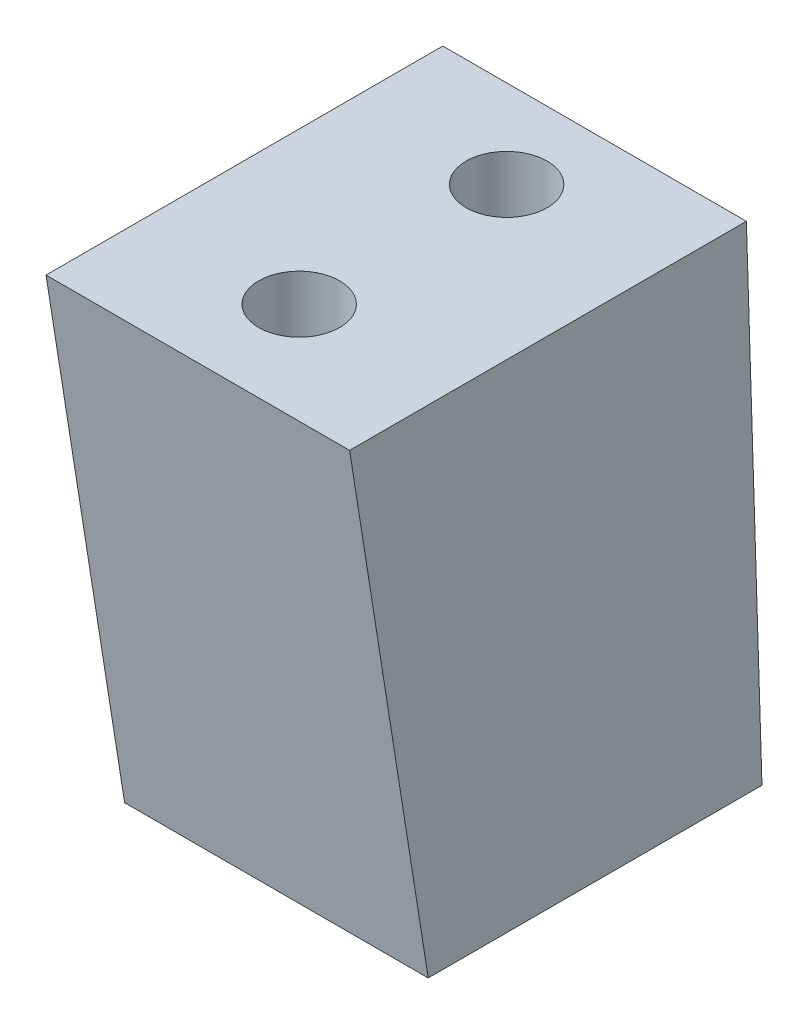
ISO-10303-21;
HEADER;
FILE_DESCRIPTION(('STEP AP214'),'2;1');
FILE_NAME('part.step','',(''),(''),'','','');
FILE_SCHEMA(('AUTOMOTIVE_DESIGN { 1 0 10303 214 1 1 1 1 }'));
ENDSEC;
DATA;
#1=APPLICATION_CONTEXT('core data for automotive mechanical design processes');
#2=APPLICATION_PROTOCOL_DEFINITION('international standard','automotive_design',2000,#1);
#3=PRODUCT_CONTEXT('',#1,'mechanical');
#4=PRODUCT('Part','Part','',(#3));
#5=PRODUCT_RELATED_PRODUCT_CATEGORY('part','',(#4));
#6=PRODUCT_DEFINITION_FORMATION('','',#4);
#7=PRODUCT_DEFINITION_CONTEXT('part definition',#1,'design');
#8=PRODUCT_DEFINITION('design','',#6,#7);
#9=PRODUCT_DEFINITION_SHAPE('','',#8);
#10=(LENGTH_UNIT() NAMED_UNIT(*) SI_UNIT(.MILLI.,.METRE.));
#11=(NAMED_UNIT(*) PLANE_ANGLE_UNIT() SI_UNIT($,.RADIAN.));
#12=(NAMED_UNIT(*) SI_UNIT($,.STERADIAN.) SOLID_ANGLE_UNIT());
#13=UNCERTAINTY_MEASURE_WITH_UNIT(LENGTH_MEASURE(1.E-05),#10,'distance_accuracy_value','');
#14=(GEOMETRIC_REPRESENTATION_CONTEXT(3) GLOBAL_UNCERTAINTY_ASSIGNED_CONTEXT((#13)) GLOBAL_UNIT_ASSIGNED_CONTEXT((#10,
#11,#12)) REPRESENTATION_CONTEXT('',''));
#15=CARTESIAN_POINT('',(0.,0.,0.));
#16=DIRECTION('',(0.,0.,1.));
#17=DIRECTION('',(1.,0.,0.));
#18=AXIS2_PLACEMENT_3D('',#15,#16,#17);
#19=CARTESIAN_POINT('',(0.,0.,-20.5));
#20=DIRECTION('',(1.,0.,0.));
#21=DIRECTION('',(0.,0.,-1.));
#22=AXIS2_PLACEMENT_3D('',#19,#20,#21);
#23=PLANE('',#22);
#24=DIRECTION('',(0.,0.,1.));
#25=VECTOR('',#24,1.);
#26=CARTESIAN_POINT('',(0.,0.,-20.5));
#27=LINE('',#26,#25);
#28=CARTESIAN_POINT('',(0.,0.,-20.4905720433827));
#29=VERTEX_POINT('',#28);
#30=CARTESIAN_POINT('',(0.,0.,-4.00000000000018));
#31=VERTEX_POINT('',#30);
#32=EDGE_CURVE('E93',#29,#31,#27,.T.);
#33=ORIENTED_EDGE('',*,*,#32,.F.);
#34=DIRECTION('',(0.,0.999506560365732,0.0314107590781247));
#35=VECTOR('',#34,1.);
#36=CARTESIAN_POINT('',(0.,-0.00029599314704986,-20.4905813453421));
#37=LINE('',#36,#35);
#38=CARTESIAN_POINT('',(0.,24.52,-19.7199999999998));
#39=VERTEX_POINT('',#38);
#40=EDGE_CURVE('E11',#29,#39,#37,.T.);
#41=ORIENTED_EDGE('',*,*,#40,.T.);
#42=DIRECTION('',(0.,0.,1.));
#43=VECTOR('',#42,1.);
#44=CARTESIAN_POINT('',(0.,24.52,-20.5));
#45=LINE('',#44,#43);
#46=CARTESIAN_POINT('',(0.,24.52,-0.116413523242619));
#47=VERTEX_POINT('',#46);
#48=EDGE_CURVE('E75',#39,#47,#45,.T.);
#49=ORIENTED_EDGE('',*,*,#48,.T.);
#50=DIRECTION('',(0.,0.987688340595138,0.156434465040228));
#51=VECTOR('',#50,1.);
#52=CARTESIAN_POINT('',(0.,-2.54939020359325,-4.40378374056514));
#53=LINE('',#52,#51);
#54=EDGE_CURVE('E78',#47,#31,#53,.F.);
#55=ORIENTED_EDGE('',*,*,#54,.T.);
#56=EDGE_LOOP('',(#33,#41,#49,#55));
#57=FACE_BOUND('',#56,.T.);
#58=ADVANCED_FACE('F35',(#57),#23,.T.);
#59=CARTESIAN_POINT('',(0.,0.,-20.5));
#60=DIRECTION('',(0.,-1.,0.));
#61=DIRECTION('',(0.,0.,-1.));
#62=AXIS2_PLACEMENT_3D('',#59,#60,#61);
#63=PLANE('',#62);
#64=CARTESIAN_POINT('',(-7.5,0.,-15.375));
#65=DIRECTION('',(0.,-1.,0.));
#66=DIRECTION('',(0.,0.,-1.));
#67=AXIS2_PLACEMENT_3D('',#64,#65,#66);
#68=CIRCLE('',#67,2.);
#69=CARTESIAN_POINT('',(-7.5,0.,-17.375));
#70=VERTEX_POINT('',#69);
#71=EDGE_CURVE('E119',#70,#70,#68,.T.);
#72=ORIENTED_EDGE('',*,*,#71,.F.);
#73=EDGE_LOOP('',(#72));
#74=FACE_BOUND('',#73,.T.);
#75=CARTESIAN_POINT('',(-7.5,0.,-7.6875));
#76=DIRECTION('',(0.,-1.,0.));
#77=DIRECTION('',(0.,0.,-1.));
#78=AXIS2_PLACEMENT_3D('',#75,#76,#77);
#79=CIRCLE('',#78,2.);
#80=CARTESIAN_POINT('',(-7.5,0.,-9.6875));
#81=VERTEX_POINT('',#80);
#82=EDGE_CURVE('E112',#81,#81,#79,.T.);
#83=ORIENTED_EDGE('',*,*,#82,.F.);
#84=EDGE_LOOP('',(#83));
#85=FACE_BOUND('',#84,.T.);
#86=DIRECTION('',(0.,0.,1.));
#87=VECTOR('',#86,1.);
#88=CARTESIAN_POINT('',(-15.,0.,-20.5));
#89=LINE('',#88,#87);
#90=CARTESIAN_POINT('',(-15.,0.,-20.4905720433827));
#91=VERTEX_POINT('',#90);
#92=CARTESIAN_POINT('',(-15.,0.,-4.00000000000018));
#93=VERTEX_POINT('',#92);
#94=EDGE_CURVE('E107',#91,#93,#89,.T.);
#95=ORIENTED_EDGE('',*,*,#94,.F.);
#96=DIRECTION('',(1.,0.,0.));
#97=VECTOR('',#96,1.);
#98=CARTESIAN_POINT('',(0.,0.,-20.4905720433827));
#99=LINE('',#98,#97);
#100=EDGE_CURVE('E44',#91,#29,#99,.T.);
#101=ORIENTED_EDGE('',*,*,#100,.T.);
#102=ORIENTED_EDGE('',*,*,#32,.T.);
#103=DIRECTION('',(-1.,0.,0.));
#104=VECTOR('',#103,1.);
#105=CARTESIAN_POINT('',(0.,0.,-4.00000000000018));
#106=LINE('',#105,#104);
#107=EDGE_CURVE('E97',#31,#93,#106,.T.);
#108=ORIENTED_EDGE('',*,*,#107,.T.);
#109=EDGE_LOOP('',(#95,#101,#102,#108));
#110=FACE_BOUND('',#109,.T.);
#111=ADVANCED_FACE('F167',(#74,#85,#110),#63,.T.);
#112=CARTESIAN_POINT('',(-15.,0.,-20.5));
#113=DIRECTION('',(-1.,0.,0.));
#114=DIRECTION('',(0.,0.,1.));
#115=AXIS2_PLACEMENT_3D('',#112,#113,#114);
#116=PLANE('',#115);
#117=DIRECTION('',(0.,0.,1.));
#118=VECTOR('',#117,1.);
#119=CARTESIAN_POINT('',(-15.,24.52,-20.5));
#120=LINE('',#119,#118);
#121=CARTESIAN_POINT('',(-15.,24.52,-19.7199999999998));
#122=VERTEX_POINT('',#121);
#123=CARTESIAN_POINT('',(-15.,24.52,-0.116413523242619));
#124=VERTEX_POINT('',#123);
#125=EDGE_CURVE('E84',#122,#124,#120,.T.);
#126=ORIENTED_EDGE('',*,*,#125,.F.);
#127=DIRECTION('',(0.,-0.999506560365732,-0.0314107590781247));
#128=VECTOR('',#127,1.);
#129=CARTESIAN_POINT('',(-15.,-0.000295993147049864,-20.4905813453421));
#130=LINE('',#129,#128);
#131=EDGE_CURVE('E58',#122,#91,#130,.T.);
#132=ORIENTED_EDGE('',*,*,#131,.T.);
#133=ORIENTED_EDGE('',*,*,#94,.T.);
#134=DIRECTION('',(0.,-0.987688340595138,-0.156434465040228));
#135=VECTOR('',#134,1.);
#136=CARTESIAN_POINT('',(-15.,-2.54939020359325,-4.40378374056514));
#137=LINE('',#136,#135);
#138=EDGE_CURVE('E99',#93,#124,#137,.F.);
#139=ORIENTED_EDGE('',*,*,#138,.T.);
#140=EDGE_LOOP('',(#126,#132,#133,#139));
#141=FACE_BOUND('',#140,.T.);
#142=ADVANCED_FACE('F106',(#141),#116,.T.);
#143=CARTESIAN_POINT('',(0.,24.52,-20.5));
#144=DIRECTION('',(0.,1.,0.));
#145=DIRECTION('',(-1.,0.,0.));
#146=AXIS2_PLACEMENT_3D('',#143,#144,#145);
#147=PLANE('',#146);
#148=CARTESIAN_POINT('',(-7.5,24.52,-15.375));
#149=DIRECTION('',(0.,1.,0.));
#150=DIRECTION('',(-1.,0.,0.));
#151=AXIS2_PLACEMENT_3D('',#148,#149,#150);
#152=CIRCLE('',#151,2.);
#153=CARTESIAN_POINT('',(-9.5,24.52,-15.375));
#154=VERTEX_POINT('',#153);
#155=EDGE_CURVE('E130',#154,#154,#152,.T.);
#156=ORIENTED_EDGE('',*,*,#155,.F.);
#157=EDGE_LOOP('',(#156));
#158=FACE_BOUND('',#157,.T.);
#159=CARTESIAN_POINT('',(-7.5,24.52,-5.125));
#160=DIRECTION('',(0.,1.,0.));
#161=DIRECTION('',(-1.,0.,0.));
#162=AXIS2_PLACEMENT_3D('',#159,#160,#161);
#163=CIRCLE('',#162,2.);
#164=CARTESIAN_POINT('',(-9.5,24.52,-5.125));
#165=VERTEX_POINT('',#164);
#166=EDGE_CURVE('E124',#165,#165,#163,.T.);
#167=ORIENTED_EDGE('',*,*,#166,.F.);
#168=EDGE_LOOP('',(#167));
#169=FACE_BOUND('',#168,.T.);
#170=ORIENTED_EDGE('',*,*,#48,.F.);
#171=DIRECTION('',(-1.,0.,0.));
#172=VECTOR('',#171,1.);
#173=CARTESIAN_POINT('',(-15.,24.52,-19.7199999999998));
#174=LINE('',#173,#172);
#175=EDGE_CURVE('E103',#39,#122,#174,.T.);
#176=ORIENTED_EDGE('',*,*,#175,.T.);
#177=ORIENTED_EDGE('',*,*,#125,.T.);
#178=DIRECTION('',(-1.,0.,0.));
#179=VECTOR('',#178,1.);
#180=CARTESIAN_POINT('',(0.,24.52,-0.116413523242619));
#181=LINE('',#180,#179);
#182=EDGE_CURVE('E88',#124,#47,#181,.F.);
#183=ORIENTED_EDGE('',*,*,#182,.T.);
#184=EDGE_LOOP('',(#170,#176,#177,#183));
#185=FACE_BOUND('',#184,.T.);
#186=ADVANCED_FACE('F89',(#158,#169,#185),#147,.T.);
#187=CARTESIAN_POINT('',(-7.5,3.,-7.6875));
#188=DIRECTION('',(0.,-1.,0.));
#189=DIRECTION('',(0.,0.,-1.));
#190=AXIS2_PLACEMENT_3D('',#187,#188,#189);
#191=CYLINDRICAL_SURFACE('',#190,2.);
#192=CARTESIAN_POINT('',(-7.5,3.,-7.6875));
#193=DIRECTION('',(0.,-1.,0.));
#194=DIRECTION('',(0.,0.,-1.));
#195=AXIS2_PLACEMENT_3D('',#192,#193,#194);
#196=CIRCLE('',#195,2.);
#197=CARTESIAN_POINT('',(-7.5,3.,-9.6875));
#198=VERTEX_POINT('',#197);
#199=EDGE_CURVE('E115',#198,#198,#196,.T.);
#200=ORIENTED_EDGE('',*,*,#199,.F.);
#201=EDGE_LOOP('',(#200));
#202=FACE_BOUND('',#201,.T.);
#203=ORIENTED_EDGE('',*,*,#82,.T.);
#204=EDGE_LOOP('',(#203));
#205=FACE_BOUND('',#204,.T.);
#206=ADVANCED_FACE('F147',(#202,#205),#191,.F.);
#207=CARTESIAN_POINT('',(0.,3.,0.));
#208=DIRECTION('',(0.,-1.,0.));
#209=DIRECTION('',(0.,0.,-1.));
#210=AXIS2_PLACEMENT_3D('',#207,#208,#209);
#211=PLANE('',#210);
#212=ORIENTED_EDGE('',*,*,#199,.T.);
#213=EDGE_LOOP('',(#212));
#214=FACE_BOUND('',#213,.T.);
#215=ADVANCED_FACE('F215',(#214),#211,.T.);
#216=CARTESIAN_POINT('',(-7.5,3.,-15.375));
#217=DIRECTION('',(0.,-1.,0.));
#218=DIRECTION('',(0.,0.,-1.));
#219=AXIS2_PLACEMENT_3D('',#216,#217,#218);
#220=CYLINDRICAL_SURFACE('',#219,2.);
#221=CARTESIAN_POINT('',(-7.5,3.,-15.375));
#222=DIRECTION('',(0.,-1.,0.));
#223=DIRECTION('',(0.,0.,-1.));
#224=AXIS2_PLACEMENT_3D('',#221,#222,#223);
#225=CIRCLE('',#224,2.);
#226=CARTESIAN_POINT('',(-7.5,3.,-17.375));
#227=VERTEX_POINT('',#226);
#228=EDGE_CURVE('E85',#227,#227,#225,.T.);
#229=ORIENTED_EDGE('',*,*,#228,.F.);
#230=EDGE_LOOP('',(#229));
#231=FACE_BOUND('',#230,.T.);
#232=ORIENTED_EDGE('',*,*,#71,.T.);
#233=EDGE_LOOP('',(#232));
#234=FACE_BOUND('',#233,.T.);
#235=ADVANCED_FACE('F162',(#231,#234),#220,.F.);
#236=CARTESIAN_POINT('',(0.,3.,0.));
#237=DIRECTION('',(0.,-1.,0.));
#238=DIRECTION('',(0.,0.,-1.));
#239=AXIS2_PLACEMENT_3D('',#236,#237,#238);
#240=PLANE('',#239);
#241=ORIENTED_EDGE('',*,*,#228,.T.);
#242=EDGE_LOOP('',(#241));
#243=FACE_BOUND('',#242,.T.);
#244=ADVANCED_FACE('F153',(#243),#240,.T.);
#245=CARTESIAN_POINT('',(-7.5,21.52,-5.125));
#246=DIRECTION('',(0.,1.,0.));
#247=DIRECTION('',(-1.,0.,0.));
#248=AXIS2_PLACEMENT_3D('',#245,#246,#247);
#249=CYLINDRICAL_SURFACE('',#248,2.);
#250=CARTESIAN_POINT('',(-7.5,21.52,-5.125));
#251=DIRECTION('',(0.,1.,0.));
#252=DIRECTION('',(-1.,0.,0.));
#253=AXIS2_PLACEMENT_3D('',#250,#251,#252);
#254=CIRCLE('',#253,2.);
#255=CARTESIAN_POINT('',(-9.5,21.52,-5.125));
#256=VERTEX_POINT('',#255);
#257=EDGE_CURVE('E127',#256,#256,#254,.T.);
#258=ORIENTED_EDGE('',*,*,#257,.F.);
#259=EDGE_LOOP('',(#258));
#260=FACE_BOUND('',#259,.T.);
#261=ORIENTED_EDGE('',*,*,#166,.T.);
#262=EDGE_LOOP('',(#261));
#263=FACE_BOUND('',#262,.T.);
#264=ADVANCED_FACE('F151',(#260,#263),#249,.F.);
#265=CARTESIAN_POINT('',(0.,21.52,0.));
#266=DIRECTION('',(0.,1.,0.));
#267=DIRECTION('',(-1.,0.,0.));
#268=AXIS2_PLACEMENT_3D('',#265,#266,#267);
#269=PLANE('',#268);
#270=ORIENTED_EDGE('',*,*,#257,.T.);
#271=EDGE_LOOP('',(#270));
#272=FACE_BOUND('',#271,.T.);
#273=ADVANCED_FACE('F141',(#272),#269,.T.);
#274=CARTESIAN_POINT('',(-7.5,21.52,-15.375));
#275=DIRECTION('',(0.,1.,0.));
#276=DIRECTION('',(-1.,0.,0.));
#277=AXIS2_PLACEMENT_3D('',#274,#275,#276);
#278=CYLINDRICAL_SURFACE('',#277,2.);
#279=CARTESIAN_POINT('',(-7.5,21.52,-15.375));
#280=DIRECTION('',(0.,1.,0.));
#281=DIRECTION('',(-1.,0.,0.));
#282=AXIS2_PLACEMENT_3D('',#279,#280,#281);
#283=CIRCLE('',#282,2.);
#284=CARTESIAN_POINT('',(-9.5,21.52,-15.375));
#285=VERTEX_POINT('',#284);
#286=EDGE_CURVE('E116',#285,#285,#283,.T.);
#287=ORIENTED_EDGE('',*,*,#286,.F.);
#288=EDGE_LOOP('',(#287));
#289=FACE_BOUND('',#288,.T.);
#290=ORIENTED_EDGE('',*,*,#155,.T.);
#291=EDGE_LOOP('',(#290));
#292=FACE_BOUND('',#291,.T.);
#293=ADVANCED_FACE('F138',(#289,#292),#278,.F.);
#294=CARTESIAN_POINT('',(0.,21.52,0.));
#295=DIRECTION('',(0.,1.,0.));
#296=DIRECTION('',(-1.,0.,0.));
#297=AXIS2_PLACEMENT_3D('',#294,#295,#296);
#298=PLANE('',#297);
#299=ORIENTED_EDGE('',*,*,#286,.T.);
#300=EDGE_LOOP('',(#299));
#301=FACE_BOUND('',#300,.T.);
#302=ADVANCED_FACE('F136',(#301),#298,.T.);
#303=CARTESIAN_POINT('',(0.,25.2550060587018,0.));
#304=DIRECTION('',(0.,0.156434465040228,-0.987688340595138));
#305=DIRECTION('',(1.,0.,0.));
#306=AXIS2_PLACEMENT_3D('',#303,#304,#305);
#307=PLANE('',#306);
#308=ORIENTED_EDGE('',*,*,#138,.F.);
#309=ORIENTED_EDGE('',*,*,#107,.F.);
#310=ORIENTED_EDGE('',*,*,#54,.F.);
#311=ORIENTED_EDGE('',*,*,#182,.F.);
#312=EDGE_LOOP('',(#308,#309,#310,#311));
#313=FACE_BOUND('',#312,.T.);
#314=ADVANCED_FACE('F95',(#313),#307,.F.);
#315=CARTESIAN_POINT('',(0.,24.52,-19.7199999999998));
#316=DIRECTION('',(0.,0.0314107590781247,-0.999506560365732));
#317=DIRECTION('',(1.,0.,0.));
#318=AXIS2_PLACEMENT_3D('',#315,#316,#317);
#319=PLANE('',#318);
#320=ORIENTED_EDGE('',*,*,#40,.F.);
#321=ORIENTED_EDGE('',*,*,#100,.F.);
#322=ORIENTED_EDGE('',*,*,#131,.F.);
#323=ORIENTED_EDGE('',*,*,#175,.F.);
#324=EDGE_LOOP('',(#320,#321,#322,#323));
#325=FACE_BOUND('',#324,.T.);
#326=ADVANCED_FACE('F38',(#325),#319,.T.);
#327=CLOSED_SHELL('',(#58,#111,#142,#186,#206,#215,#235,#244,#264,#273,#293,#302,#314,#326));
#328=MANIFOLD_SOLID_BREP('B2',#327);
#329=ADVANCED_BREP_SHAPE_REPRESENTATION('',(#18,#328),#14);
#330=SHAPE_DEFINITION_REPRESENTATION(#9,#329);
ENDSEC;
END-ISO-10303-21;
